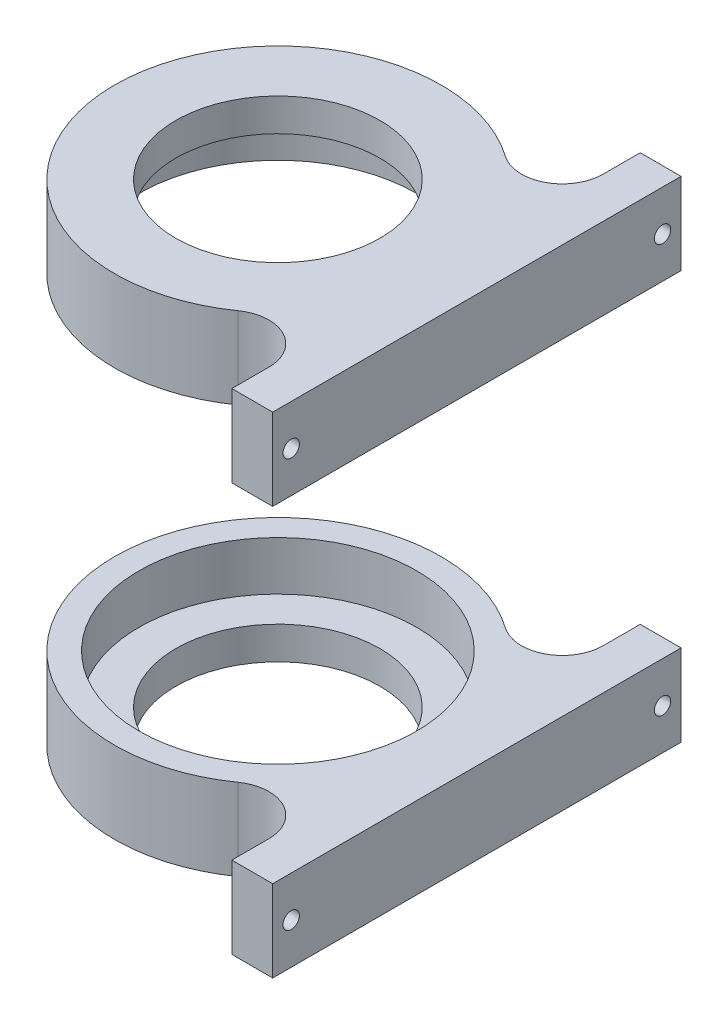
ISO-10303-21;
HEADER;
FILE_DESCRIPTION(('STEP AP214'),'2;1');
FILE_NAME('part.step','',(''),(''),'','','');
FILE_SCHEMA(('AUTOMOTIVE_DESIGN { 1 0 10303 214 1 1 1 1 }'));
ENDSEC;
DATA;
#1=APPLICATION_CONTEXT('core data for automotive mechanical design processes');
#2=APPLICATION_PROTOCOL_DEFINITION('international standard','automotive_design',2000,#1);
#3=PRODUCT_CONTEXT('',#1,'mechanical');
#4=PRODUCT('Part','Part','',(#3));
#5=PRODUCT_RELATED_PRODUCT_CATEGORY('part','',(#4));
#6=PRODUCT_DEFINITION_FORMATION('','',#4);
#7=PRODUCT_DEFINITION_CONTEXT('part definition',#1,'design');
#8=PRODUCT_DEFINITION('design','',#6,#7);
#9=PRODUCT_DEFINITION_SHAPE('','',#8);
#10=(LENGTH_UNIT() NAMED_UNIT(*) SI_UNIT(.MILLI.,.METRE.));
#11=(NAMED_UNIT(*) PLANE_ANGLE_UNIT() SI_UNIT($,.RADIAN.));
#12=(NAMED_UNIT(*) SI_UNIT($,.STERADIAN.) SOLID_ANGLE_UNIT());
#13=UNCERTAINTY_MEASURE_WITH_UNIT(LENGTH_MEASURE(1.E-05),#10,'distance_accuracy_value','');
#14=(GEOMETRIC_REPRESENTATION_CONTEXT(3) GLOBAL_UNCERTAINTY_ASSIGNED_CONTEXT((#13)) GLOBAL_UNIT_ASSIGNED_CONTEXT((#10,
#11,#12)) REPRESENTATION_CONTEXT('',''));
#15=CARTESIAN_POINT('',(0.,0.,0.));
#16=DIRECTION('',(0.,0.,1.));
#17=DIRECTION('',(1.,0.,0.));
#18=AXIS2_PLACEMENT_3D('',#15,#16,#17);
#19=CARTESIAN_POINT('',(-188.729833462074,-74.,50.));
#20=DIRECTION('',(0.,1.,0.));
#21=DIRECTION('',(0.,0.,1.));
#22=AXIS2_PLACEMENT_3D('',#19,#20,#21);
#23=CYLINDRICAL_SURFACE('',#22,34.);
#24=CARTESIAN_POINT('',(-188.729833462074,40.,50.));
#25=DIRECTION('',(0.,-1.,0.));
#26=DIRECTION('',(0.,0.,-1.));
#27=AXIS2_PLACEMENT_3D('',#24,#25,#26);
#28=CIRCLE('',#27,34.);
#29=CARTESIAN_POINT('',(-188.729833462074,40.,16.));
#30=VERTEX_POINT('',#29);
#31=EDGE_CURVE('E163',#30,#30,#28,.T.);
#32=ORIENTED_EDGE('',*,*,#31,.T.);
#33=EDGE_LOOP('',(#32));
#34=FACE_BOUND('',#33,.T.);
#35=CARTESIAN_POINT('',(-188.729833462074,52.,50.));
#36=DIRECTION('',(0.,1.,0.));
#37=DIRECTION('',(0.,0.,1.));
#38=AXIS2_PLACEMENT_3D('',#35,#36,#37);
#39=CIRCLE('',#38,34.);
#40=CARTESIAN_POINT('',(-188.729833462074,52.,84.));
#41=VERTEX_POINT('',#40);
#42=EDGE_CURVE('E12',#41,#41,#39,.F.);
#43=ORIENTED_EDGE('',*,*,#42,.F.);
#44=EDGE_LOOP('',(#43));
#45=FACE_BOUND('',#44,.T.);
#46=ADVANCED_FACE('F53',(#34,#45),#23,.F.);
#47=CARTESIAN_POINT('',(-160.,40.,90.9218360932337));
#48=DIRECTION('',(0.,1.,0.));
#49=DIRECTION('',(0.,0.,1.));
#50=AXIS2_PLACEMENT_3D('',#47,#48,#49);
#51=CYLINDRICAL_SURFACE('',#50,10.);
#52=DIRECTION('',(0.,1.,0.));
#53=VECTOR('',#52,1.);
#54=CARTESIAN_POINT('',(-165.745966692415,40.,82.737468874587));
#55=LINE('',#54,#53);
#56=CARTESIAN_POINT('',(-165.745966692415,40.,82.737468874587));
#57=VERTEX_POINT('',#56);
#58=CARTESIAN_POINT('',(-165.745966692415,60.,82.737468874587));
#59=VERTEX_POINT('',#58);
#60=EDGE_CURVE('E164',#57,#59,#55,.T.);
#61=ORIENTED_EDGE('',*,*,#60,.F.);
#62=CARTESIAN_POINT('',(-160.,40.,90.9218360932337));
#63=DIRECTION('',(0.,-1.,0.));
#64=DIRECTION('',(0.,0.,-1.));
#65=AXIS2_PLACEMENT_3D('',#62,#63,#64);
#66=CIRCLE('',#65,10.);
#67=CARTESIAN_POINT('',(-150.,40.,90.9218360932337));
#68=VERTEX_POINT('',#67);
#69=EDGE_CURVE('E151',#57,#68,#66,.T.);
#70=ORIENTED_EDGE('',*,*,#69,.T.);
#71=DIRECTION('',(0.,-1.,0.));
#72=VECTOR('',#71,1.);
#73=CARTESIAN_POINT('',(-150.,40.,90.9218360932337));
#74=LINE('',#73,#72);
#75=CARTESIAN_POINT('',(-150.,60.,90.9218360932337));
#76=VERTEX_POINT('',#75);
#77=EDGE_CURVE('E161',#76,#68,#74,.T.);
#78=ORIENTED_EDGE('',*,*,#77,.F.);
#79=CARTESIAN_POINT('',(-160.,60.,90.9218360932337));
#80=DIRECTION('',(0.,-1.,0.));
#81=DIRECTION('',(0.,0.,-1.));
#82=AXIS2_PLACEMENT_3D('',#79,#80,#81);
#83=CIRCLE('',#82,10.);
#84=EDGE_CURVE('E84',#76,#59,#83,.F.);
#85=ORIENTED_EDGE('',*,*,#84,.T.);
#86=EDGE_LOOP('',(#61,#70,#78,#85));
#87=FACE_BOUND('',#86,.T.);
#88=ADVANCED_FACE('F206',(#87),#51,.F.);
#89=CARTESIAN_POINT('',(-160.,40.,9.0781639067663));
#90=DIRECTION('',(0.,1.,0.));
#91=DIRECTION('',(0.,0.,1.));
#92=AXIS2_PLACEMENT_3D('',#89,#90,#91);
#93=CYLINDRICAL_SURFACE('',#92,10.);
#94=DIRECTION('',(0.,-1.,0.));
#95=VECTOR('',#94,1.);
#96=CARTESIAN_POINT('',(-150.,40.,9.0781639067663));
#97=LINE('',#96,#95);
#98=CARTESIAN_POINT('',(-150.,40.,9.0781639067663));
#99=VERTEX_POINT('',#98);
#100=CARTESIAN_POINT('',(-150.,60.,9.0781639067663));
#101=VERTEX_POINT('',#100);
#102=EDGE_CURVE('E61',#99,#101,#97,.F.);
#103=ORIENTED_EDGE('',*,*,#102,.F.);
#104=CARTESIAN_POINT('',(-160.,40.,9.0781639067663));
#105=DIRECTION('',(0.,-1.,0.));
#106=DIRECTION('',(0.,0.,-1.));
#107=AXIS2_PLACEMENT_3D('',#104,#105,#106);
#108=CIRCLE('',#107,10.);
#109=CARTESIAN_POINT('',(-165.745966692415,40.,17.262531125413));
#110=VERTEX_POINT('',#109);
#111=EDGE_CURVE('E159',#99,#110,#108,.T.);
#112=ORIENTED_EDGE('',*,*,#111,.T.);
#113=DIRECTION('',(0.,1.,0.));
#114=VECTOR('',#113,1.);
#115=CARTESIAN_POINT('',(-165.745966692415,40.,17.262531125413));
#116=LINE('',#115,#114);
#117=CARTESIAN_POINT('',(-165.745966692415,60.,17.262531125413));
#118=VERTEX_POINT('',#117);
#119=EDGE_CURVE('E172',#118,#110,#116,.F.);
#120=ORIENTED_EDGE('',*,*,#119,.F.);
#121=CARTESIAN_POINT('',(-160.,60.,9.0781639067663));
#122=DIRECTION('',(0.,-1.,0.));
#123=DIRECTION('',(0.,0.,-1.));
#124=AXIS2_PLACEMENT_3D('',#121,#122,#123);
#125=CIRCLE('',#124,10.);
#126=EDGE_CURVE('E167',#118,#101,#125,.F.);
#127=ORIENTED_EDGE('',*,*,#126,.T.);
#128=EDGE_LOOP('',(#103,#112,#120,#127));
#129=FACE_BOUND('',#128,.T.);
#130=ADVANCED_FACE('F192',(#129),#93,.F.);
#131=CARTESIAN_POINT('',(-150.,60.,100.));
#132=DIRECTION('',(0.,-1.,0.));
#133=DIRECTION('',(0.,0.,-1.));
#134=AXIS2_PLACEMENT_3D('',#131,#132,#133);
#135=PLANE('',#134);
#136=ORIENTED_EDGE('',*,*,#84,.F.);
#137=DIRECTION('',(0.,0.,1.));
#138=VECTOR('',#137,1.);
#139=CARTESIAN_POINT('',(-150.,60.,100.));
#140=LINE('',#139,#138);
#141=CARTESIAN_POINT('',(-150.,60.,100.));
#142=VERTEX_POINT('',#141);
#143=EDGE_CURVE('E92',#76,#142,#140,.T.);
#144=ORIENTED_EDGE('',*,*,#143,.T.);
#145=DIRECTION('',(-1.,0.,0.));
#146=VECTOR('',#145,1.);
#147=CARTESIAN_POINT('',(-140.,60.,100.));
#148=LINE('',#147,#146);
#149=CARTESIAN_POINT('',(-140.,60.,100.));
#150=VERTEX_POINT('',#149);
#151=EDGE_CURVE('E134',#150,#142,#148,.T.);
#152=ORIENTED_EDGE('',*,*,#151,.F.);
#153=DIRECTION('',(0.,0.,1.));
#154=VECTOR('',#153,1.);
#155=CARTESIAN_POINT('',(-140.,60.,100.));
#156=LINE('',#155,#154);
#157=CARTESIAN_POINT('',(-140.,60.,0.));
#158=VERTEX_POINT('',#157);
#159=EDGE_CURVE('E126',#158,#150,#156,.T.);
#160=ORIENTED_EDGE('',*,*,#159,.F.);
#161=DIRECTION('',(-1.,0.,0.));
#162=VECTOR('',#161,1.);
#163=CARTESIAN_POINT('',(-140.,60.,0.));
#164=LINE('',#163,#162);
#165=CARTESIAN_POINT('',(-150.,60.,0.));
#166=VERTEX_POINT('',#165);
#167=EDGE_CURVE('E131',#158,#166,#164,.T.);
#168=ORIENTED_EDGE('',*,*,#167,.T.);
#169=EDGE_CURVE('E195',#166,#101,#140,.T.);
#170=ORIENTED_EDGE('',*,*,#169,.T.);
#171=ORIENTED_EDGE('',*,*,#126,.F.);
#172=CARTESIAN_POINT('',(-188.729833462074,60.,50.));
#173=DIRECTION('',(0.,-1.,0.));
#174=DIRECTION('',(0.,0.,-1.));
#175=AXIS2_PLACEMENT_3D('',#172,#173,#174);
#176=CIRCLE('',#175,40.);
#177=EDGE_CURVE('E166',#59,#118,#176,.T.);
#178=ORIENTED_EDGE('',*,*,#177,.F.);
#179=EDGE_LOOP('',(#136,#144,#152,#160,#168,#170,#171,#178));
#180=FACE_BOUND('',#179,.T.);
#181=CARTESIAN_POINT('',(-188.729833462074,60.,50.));
#182=DIRECTION('',(0.,1.,0.));
#183=DIRECTION('',(0.,0.,1.));
#184=AXIS2_PLACEMENT_3D('',#181,#182,#183);
#185=CIRCLE('',#184,25.);
#186=CARTESIAN_POINT('',(-188.729833462074,60.,75.));
#187=VERTEX_POINT('',#186);
#188=EDGE_CURVE('E259',#187,#187,#185,.T.);
#189=ORIENTED_EDGE('',*,*,#188,.F.);
#190=EDGE_LOOP('',(#189));
#191=FACE_BOUND('',#190,.T.);
#192=ADVANCED_FACE('F128',(#180,#191),#135,.F.);
#193=CARTESIAN_POINT('',(-188.729833462074,40.,50.));
#194=DIRECTION('',(0.,1.,0.));
#195=DIRECTION('',(0.,0.,1.));
#196=AXIS2_PLACEMENT_3D('',#193,#194,#195);
#197=CYLINDRICAL_SURFACE('',#196,40.);
#198=CARTESIAN_POINT('',(-188.729833462074,40.,50.));
#199=DIRECTION('',(0.,-1.,0.));
#200=DIRECTION('',(0.,0.,-1.));
#201=AXIS2_PLACEMENT_3D('',#198,#199,#200);
#202=CIRCLE('',#201,40.);
#203=EDGE_CURVE('E175',#57,#110,#202,.T.);
#204=ORIENTED_EDGE('',*,*,#203,.F.);
#205=ORIENTED_EDGE('',*,*,#60,.T.);
#206=ORIENTED_EDGE('',*,*,#177,.T.);
#207=ORIENTED_EDGE('',*,*,#119,.T.);
#208=EDGE_LOOP('',(#204,#205,#206,#207));
#209=FACE_BOUND('',#208,.T.);
#210=ADVANCED_FACE('F186',(#209),#197,.T.);
#211=CARTESIAN_POINT('',(-188.729833462074,40.,50.));
#212=DIRECTION('',(0.,-1.,0.));
#213=DIRECTION('',(0.,0.,-1.));
#214=AXIS2_PLACEMENT_3D('',#211,#212,#213);
#215=PLANE('',#214);
#216=ORIENTED_EDGE('',*,*,#31,.F.);
#217=EDGE_LOOP('',(#216));
#218=FACE_BOUND('',#217,.T.);
#219=ORIENTED_EDGE('',*,*,#111,.F.);
#220=DIRECTION('',(0.,0.,-1.));
#221=VECTOR('',#220,1.);
#222=CARTESIAN_POINT('',(-150.,40.,100.));
#223=LINE('',#222,#221);
#224=CARTESIAN_POINT('',(-150.,40.,0.));
#225=VERTEX_POINT('',#224);
#226=EDGE_CURVE('E188',#99,#225,#223,.T.);
#227=ORIENTED_EDGE('',*,*,#226,.T.);
#228=DIRECTION('',(-1.,0.,0.));
#229=VECTOR('',#228,1.);
#230=CARTESIAN_POINT('',(-140.,40.,0.));
#231=LINE('',#230,#229);
#232=CARTESIAN_POINT('',(-140.,40.,0.));
#233=VERTEX_POINT('',#232);
#234=EDGE_CURVE('E203',#233,#225,#231,.T.);
#235=ORIENTED_EDGE('',*,*,#234,.F.);
#236=DIRECTION('',(0.,0.,-1.));
#237=VECTOR('',#236,1.);
#238=CARTESIAN_POINT('',(-140.,40.,100.));
#239=LINE('',#238,#237);
#240=CARTESIAN_POINT('',(-140.,40.,100.));
#241=VERTEX_POINT('',#240);
#242=EDGE_CURVE('E143',#241,#233,#239,.T.);
#243=ORIENTED_EDGE('',*,*,#242,.F.);
#244=DIRECTION('',(-1.,0.,0.));
#245=VECTOR('',#244,1.);
#246=CARTESIAN_POINT('',(-140.,40.,100.));
#247=LINE('',#246,#245);
#248=CARTESIAN_POINT('',(-150.,40.,100.));
#249=VERTEX_POINT('',#248);
#250=EDGE_CURVE('E155',#241,#249,#247,.T.);
#251=ORIENTED_EDGE('',*,*,#250,.T.);
#252=EDGE_CURVE('E69',#249,#68,#223,.T.);
#253=ORIENTED_EDGE('',*,*,#252,.T.);
#254=ORIENTED_EDGE('',*,*,#69,.F.);
#255=ORIENTED_EDGE('',*,*,#203,.T.);
#256=EDGE_LOOP('',(#219,#227,#235,#243,#251,#253,#254,#255));
#257=FACE_BOUND('',#256,.T.);
#258=ADVANCED_FACE('F183',(#218,#257),#215,.T.);
#259=CARTESIAN_POINT('',(-150.,0.,0.));
#260=DIRECTION('',(1.,0.,0.));
#261=DIRECTION('',(0.,0.,-1.));
#262=AXIS2_PLACEMENT_3D('',#259,#260,#261);
#263=PLANE('',#262);
#264=CARTESIAN_POINT('',(-150.,50.,95.4609180466169));
#265=DIRECTION('',(-1.,0.,0.));
#266=DIRECTION('',(0.,0.,1.));
#267=AXIS2_PLACEMENT_3D('',#264,#265,#266);
#268=CIRCLE('',#267,2.);
#269=CARTESIAN_POINT('',(-150.,50.,97.4609180466169));
#270=VERTEX_POINT('',#269);
#271=EDGE_CURVE('E267',#270,#270,#268,.T.);
#272=ORIENTED_EDGE('',*,*,#271,.F.);
#273=EDGE_LOOP('',(#272));
#274=FACE_BOUND('',#273,.T.);
#275=ORIENTED_EDGE('',*,*,#143,.F.);
#276=ORIENTED_EDGE('',*,*,#77,.T.);
#277=ORIENTED_EDGE('',*,*,#252,.F.);
#278=DIRECTION('',(0.,-1.,0.));
#279=VECTOR('',#278,1.);
#280=CARTESIAN_POINT('',(-150.,60.,100.));
#281=LINE('',#280,#279);
#282=EDGE_CURVE('E196',#142,#249,#281,.T.);
#283=ORIENTED_EDGE('',*,*,#282,.F.);
#284=EDGE_LOOP('',(#275,#276,#277,#283));
#285=FACE_BOUND('',#284,.T.);
#286=ADVANCED_FACE('F185',(#274,#285),#263,.F.);
#287=CARTESIAN_POINT('',(-140.,60.,0.));
#288=DIRECTION('',(0.,0.,1.));
#289=DIRECTION('',(1.,0.,0.));
#290=AXIS2_PLACEMENT_3D('',#287,#288,#289);
#291=PLANE('',#290);
#292=DIRECTION('',(0.,1.,0.));
#293=VECTOR('',#292,1.);
#294=CARTESIAN_POINT('',(-150.,60.,0.));
#295=LINE('',#294,#293);
#296=EDGE_CURVE('E150',#225,#166,#295,.T.);
#297=ORIENTED_EDGE('',*,*,#296,.T.);
#298=ORIENTED_EDGE('',*,*,#167,.F.);
#299=DIRECTION('',(0.,1.,0.));
#300=VECTOR('',#299,1.);
#301=CARTESIAN_POINT('',(-140.,60.,0.));
#302=LINE('',#301,#300);
#303=EDGE_CURVE('E138',#233,#158,#302,.T.);
#304=ORIENTED_EDGE('',*,*,#303,.F.);
#305=ORIENTED_EDGE('',*,*,#234,.T.);
#306=EDGE_LOOP('',(#297,#298,#304,#305));
#307=FACE_BOUND('',#306,.T.);
#308=ADVANCED_FACE('F148',(#307),#291,.F.);
#309=CARTESIAN_POINT('',(-140.,60.,100.));
#310=DIRECTION('',(0.,0.,-1.));
#311=DIRECTION('',(-1.,0.,0.));
#312=AXIS2_PLACEMENT_3D('',#309,#310,#311);
#313=PLANE('',#312);
#314=ORIENTED_EDGE('',*,*,#282,.T.);
#315=ORIENTED_EDGE('',*,*,#250,.F.);
#316=DIRECTION('',(0.,-1.,0.));
#317=VECTOR('',#316,1.);
#318=CARTESIAN_POINT('',(-140.,60.,100.));
#319=LINE('',#318,#317);
#320=EDGE_CURVE('E137',#150,#241,#319,.T.);
#321=ORIENTED_EDGE('',*,*,#320,.F.);
#322=ORIENTED_EDGE('',*,*,#151,.T.);
#323=EDGE_LOOP('',(#314,#315,#321,#322));
#324=FACE_BOUND('',#323,.T.);
#325=ADVANCED_FACE('F226',(#324),#313,.F.);
#326=CARTESIAN_POINT('',(-140.,0.,0.));
#327=DIRECTION('',(1.,0.,0.));
#328=DIRECTION('',(0.,0.,-1.));
#329=AXIS2_PLACEMENT_3D('',#326,#327,#328);
#330=PLANE('',#329);
#331=CARTESIAN_POINT('',(-140.,50.,4.53908195338315));
#332=DIRECTION('',(1.,0.,0.));
#333=DIRECTION('',(0.,0.,-1.));
#334=AXIS2_PLACEMENT_3D('',#331,#332,#333);
#335=CIRCLE('',#334,2.);
#336=CARTESIAN_POINT('',(-140.,50.,2.53908195338315));
#337=VERTEX_POINT('',#336);
#338=EDGE_CURVE('E264',#337,#337,#335,.T.);
#339=ORIENTED_EDGE('',*,*,#338,.F.);
#340=EDGE_LOOP('',(#339));
#341=FACE_BOUND('',#340,.T.);
#342=CARTESIAN_POINT('',(-140.,50.,95.4609180466169));
#343=DIRECTION('',(-1.,0.,0.));
#344=DIRECTION('',(0.,0.,1.));
#345=AXIS2_PLACEMENT_3D('',#342,#343,#344);
#346=CIRCLE('',#345,2.);
#347=CARTESIAN_POINT('',(-140.,50.,97.4609180466169));
#348=VERTEX_POINT('',#347);
#349=EDGE_CURVE('E270',#348,#348,#346,.T.);
#350=ORIENTED_EDGE('',*,*,#349,.T.);
#351=EDGE_LOOP('',(#350));
#352=FACE_BOUND('',#351,.T.);
#353=ORIENTED_EDGE('',*,*,#303,.T.);
#354=ORIENTED_EDGE('',*,*,#159,.T.);
#355=ORIENTED_EDGE('',*,*,#320,.T.);
#356=ORIENTED_EDGE('',*,*,#242,.T.);
#357=EDGE_LOOP('',(#353,#354,#355,#356));
#358=FACE_BOUND('',#357,.T.);
#359=ADVANCED_FACE('F141',(#341,#352,#358),#330,.T.);
#360=CARTESIAN_POINT('',(-150.,50.,4.53908195338315));
#361=DIRECTION('',(1.,0.,0.));
#362=DIRECTION('',(0.,0.,-1.));
#363=AXIS2_PLACEMENT_3D('',#360,#361,#362);
#364=CIRCLE('',#363,2.);
#365=CARTESIAN_POINT('',(-150.,50.,2.53908195338315));
#366=VERTEX_POINT('',#365);
#367=EDGE_CURVE('E261',#366,#366,#364,.T.);
#368=ORIENTED_EDGE('',*,*,#367,.T.);
#369=EDGE_LOOP('',(#368));
#370=FACE_BOUND('',#369,.T.);
#371=ORIENTED_EDGE('',*,*,#102,.T.);
#372=ORIENTED_EDGE('',*,*,#169,.F.);
#373=ORIENTED_EDGE('',*,*,#296,.F.);
#374=ORIENTED_EDGE('',*,*,#226,.F.);
#375=EDGE_LOOP('',(#371,#372,#373,#374));
#376=FACE_BOUND('',#375,.T.);
#377=ADVANCED_FACE('F229',(#370,#376),#263,.F.);
#378=CARTESIAN_POINT('',(-140.,50.,95.4609180466169));
#379=DIRECTION('',(-1.,0.,0.));
#380=DIRECTION('',(0.,0.,1.));
#381=AXIS2_PLACEMENT_3D('',#378,#379,#380);
#382=CYLINDRICAL_SURFACE('',#381,2.);
#383=ORIENTED_EDGE('',*,*,#349,.F.);
#384=EDGE_LOOP('',(#383));
#385=FACE_BOUND('',#384,.T.);
#386=ORIENTED_EDGE('',*,*,#271,.T.);
#387=EDGE_LOOP('',(#386));
#388=FACE_BOUND('',#387,.T.);
#389=ADVANCED_FACE('F232',(#385,#388),#382,.F.);
#390=CARTESIAN_POINT('',(-140.,50.,4.53908195338315));
#391=DIRECTION('',(-1.,0.,0.));
#392=DIRECTION('',(0.,0.,1.));
#393=AXIS2_PLACEMENT_3D('',#390,#391,#392);
#394=CYLINDRICAL_SURFACE('',#393,2.);
#395=ORIENTED_EDGE('',*,*,#338,.T.);
#396=EDGE_LOOP('',(#395));
#397=FACE_BOUND('',#396,.T.);
#398=ORIENTED_EDGE('',*,*,#367,.F.);
#399=EDGE_LOOP('',(#398));
#400=FACE_BOUND('',#399,.T.);
#401=ADVANCED_FACE('F239',(#397,#400),#394,.F.);
#402=CARTESIAN_POINT('',(-188.729833462074,52.,50.));
#403=DIRECTION('',(0.,1.,0.));
#404=DIRECTION('',(0.,0.,1.));
#405=AXIS2_PLACEMENT_3D('',#402,#403,#404);
#406=PLANE('',#405);
#407=CARTESIAN_POINT('',(-188.729833462074,52.,50.));
#408=DIRECTION('',(0.,1.,0.));
#409=DIRECTION('',(0.,0.,1.));
#410=AXIS2_PLACEMENT_3D('',#407,#408,#409);
#411=CIRCLE('',#410,25.);
#412=CARTESIAN_POINT('',(-188.729833462074,52.,75.));
#413=VERTEX_POINT('',#412);
#414=EDGE_CURVE('E256',#413,#413,#411,.T.);
#415=ORIENTED_EDGE('',*,*,#414,.T.);
#416=EDGE_LOOP('',(#415));
#417=FACE_BOUND('',#416,.T.);
#418=ORIENTED_EDGE('',*,*,#42,.T.);
#419=EDGE_LOOP('',(#418));
#420=FACE_BOUND('',#419,.T.);
#421=ADVANCED_FACE('F243',(#417,#420),#406,.F.);
#422=CARTESIAN_POINT('',(-188.729833462074,52.,50.));
#423=DIRECTION('',(0.,1.,0.));
#424=DIRECTION('',(0.,0.,1.));
#425=AXIS2_PLACEMENT_3D('',#422,#423,#424);
#426=CYLINDRICAL_SURFACE('',#425,25.);
#427=ORIENTED_EDGE('',*,*,#414,.F.);
#428=EDGE_LOOP('',(#427));
#429=FACE_BOUND('',#428,.T.);
#430=ORIENTED_EDGE('',*,*,#188,.T.);
#431=EDGE_LOOP('',(#430));
#432=FACE_BOUND('',#431,.T.);
#433=ADVANCED_FACE('F247',(#429,#432),#426,.F.);
#434=CLOSED_SHELL('',(#46,#88,#130,#192,#210,#258,#286,#308,#325,#359,#377,#389,#401,#421,#433));
#435=MANIFOLD_SOLID_BREP('B2',#434);
#436=CARTESIAN_POINT('',(-188.729833462074,-74.,50.));
#437=DIRECTION('',(0.,1.,0.));
#438=DIRECTION('',(0.,0.,1.));
#439=AXIS2_PLACEMENT_3D('',#436,#437,#438);
#440=CYLINDRICAL_SURFACE('',#439,34.);
#441=CARTESIAN_POINT('',(-188.729833462074,-40.,50.));
#442=DIRECTION('',(0.,1.,0.));
#443=DIRECTION('',(0.,0.,1.));
#444=AXIS2_PLACEMENT_3D('',#441,#442,#443);
#445=CIRCLE('',#444,34.);
#446=CARTESIAN_POINT('',(-188.729833462074,-40.,84.));
#447=VERTEX_POINT('',#446);
#448=EDGE_CURVE('E512',#447,#447,#445,.T.);
#449=ORIENTED_EDGE('',*,*,#448,.T.);
#450=EDGE_LOOP('',(#449));
#451=FACE_BOUND('',#450,.T.);
#452=CARTESIAN_POINT('',(-188.729833462074,-52.,50.));
#453=DIRECTION('',(0.,-1.,0.));
#454=DIRECTION('',(0.,0.,-1.));
#455=AXIS2_PLACEMENT_3D('',#452,#453,#454);
#456=CIRCLE('',#455,34.);
#457=CARTESIAN_POINT('',(-188.729833462074,-52.,16.));
#458=VERTEX_POINT('',#457);
#459=EDGE_CURVE('E51',#458,#458,#456,.F.);
#460=ORIENTED_EDGE('',*,*,#459,.F.);
#461=EDGE_LOOP('',(#460));
#462=FACE_BOUND('',#461,.T.);
#463=ADVANCED_FACE('F416',(#451,#462),#440,.F.);
#464=CARTESIAN_POINT('',(-188.729833462074,-40.,50.));
#465=DIRECTION('',(0.,-1.,0.));
#466=DIRECTION('',(0.,0.,-1.));
#467=AXIS2_PLACEMENT_3D('',#464,#465,#466);
#468=CYLINDRICAL_SURFACE('',#467,40.);
#469=CARTESIAN_POINT('',(-188.729833462074,-40.,50.));
#470=DIRECTION('',(0.,-1.,0.));
#471=DIRECTION('',(0.,0.,-1.));
#472=AXIS2_PLACEMENT_3D('',#469,#470,#471);
#473=CIRCLE('',#472,40.);
#474=CARTESIAN_POINT('',(-165.745966692415,-40.,82.7374688745869));
#475=VERTEX_POINT('',#474);
#476=CARTESIAN_POINT('',(-165.745966692415,-40.,17.2625311254131));
#477=VERTEX_POINT('',#476);
#478=EDGE_CURVE('E522',#475,#477,#473,.T.);
#479=ORIENTED_EDGE('',*,*,#478,.T.);
#480=DIRECTION('',(0.,-1.,0.));
#481=VECTOR('',#480,1.);
#482=CARTESIAN_POINT('',(-165.745966692415,-40.,17.2625311254131));
#483=LINE('',#482,#481);
#484=CARTESIAN_POINT('',(-165.745966692415,-60.,17.2625311254131));
#485=VERTEX_POINT('',#484);
#486=EDGE_CURVE('E547',#477,#485,#483,.T.);
#487=ORIENTED_EDGE('',*,*,#486,.T.);
#488=CARTESIAN_POINT('',(-188.729833462074,-60.,50.));
#489=DIRECTION('',(0.,-1.,0.));
#490=DIRECTION('',(0.,0.,-1.));
#491=AXIS2_PLACEMENT_3D('',#488,#489,#490);
#492=CIRCLE('',#491,40.);
#493=CARTESIAN_POINT('',(-165.745966692415,-60.,82.7374688745869));
#494=VERTEX_POINT('',#493);
#495=EDGE_CURVE('E517',#494,#485,#492,.T.);
#496=ORIENTED_EDGE('',*,*,#495,.F.);
#497=DIRECTION('',(0.,-1.,0.));
#498=VECTOR('',#497,1.);
#499=CARTESIAN_POINT('',(-165.745966692415,-40.,82.7374688745869));
#500=LINE('',#499,#498);
#501=EDGE_CURVE('E533',#494,#475,#500,.F.);
#502=ORIENTED_EDGE('',*,*,#501,.T.);
#503=EDGE_LOOP('',(#479,#487,#496,#502));
#504=FACE_BOUND('',#503,.T.);
#505=ADVANCED_FACE('F555',(#504),#468,.T.);
#506=CARTESIAN_POINT('',(-150.,-60.,100.));
#507=DIRECTION('',(0.,1.,0.));
#508=DIRECTION('',(0.,0.,1.));
#509=AXIS2_PLACEMENT_3D('',#506,#507,#508);
#510=PLANE('',#509);
#511=CARTESIAN_POINT('',(-160.,-60.,9.07816390676632));
#512=DIRECTION('',(0.,1.,0.));
#513=DIRECTION('',(0.,0.,1.));
#514=AXIS2_PLACEMENT_3D('',#511,#512,#513);
#515=CIRCLE('',#514,10.);
#516=CARTESIAN_POINT('',(-150.,-60.,9.07816390676632));
#517=VERTEX_POINT('',#516);
#518=EDGE_CURVE('E438',#517,#485,#515,.F.);
#519=ORIENTED_EDGE('',*,*,#518,.F.);
#520=DIRECTION('',(0.,0.,-1.));
#521=VECTOR('',#520,1.);
#522=CARTESIAN_POINT('',(-150.,-60.,100.));
#523=LINE('',#522,#521);
#524=CARTESIAN_POINT('',(-150.,-60.,0.));
#525=VERTEX_POINT('',#524);
#526=EDGE_CURVE('E577',#517,#525,#523,.T.);
#527=ORIENTED_EDGE('',*,*,#526,.T.);
#528=DIRECTION('',(-1.,0.,0.));
#529=VECTOR('',#528,1.);
#530=CARTESIAN_POINT('',(-140.,-60.,0.));
#531=LINE('',#530,#529);
#532=CARTESIAN_POINT('',(-140.,-60.,0.));
#533=VERTEX_POINT('',#532);
#534=EDGE_CURVE('E580',#533,#525,#531,.T.);
#535=ORIENTED_EDGE('',*,*,#534,.F.);
#536=DIRECTION('',(0.,0.,-1.));
#537=VECTOR('',#536,1.);
#538=CARTESIAN_POINT('',(-140.,-60.,100.));
#539=LINE('',#538,#537);
#540=CARTESIAN_POINT('',(-140.,-60.,100.));
#541=VERTEX_POINT('',#540);
#542=EDGE_CURVE('E501',#541,#533,#539,.T.);
#543=ORIENTED_EDGE('',*,*,#542,.F.);
#544=DIRECTION('',(-1.,0.,0.));
#545=VECTOR('',#544,1.);
#546=CARTESIAN_POINT('',(-140.,-60.,100.));
#547=LINE('',#546,#545);
#548=CARTESIAN_POINT('',(-150.,-60.,100.));
#549=VERTEX_POINT('',#548);
#550=EDGE_CURVE('E518',#541,#549,#547,.T.);
#551=ORIENTED_EDGE('',*,*,#550,.T.);
#552=CARTESIAN_POINT('',(-150.,-60.,90.9218360932337));
#553=VERTEX_POINT('',#552);
#554=EDGE_CURVE('E506',#549,#553,#523,.T.);
#555=ORIENTED_EDGE('',*,*,#554,.T.);
#556=CARTESIAN_POINT('',(-160.,-60.,90.9218360932337));
#557=DIRECTION('',(0.,1.,0.));
#558=DIRECTION('',(0.,0.,1.));
#559=AXIS2_PLACEMENT_3D('',#556,#557,#558);
#560=CIRCLE('',#559,10.);
#561=EDGE_CURVE('E540',#494,#553,#560,.F.);
#562=ORIENTED_EDGE('',*,*,#561,.F.);
#563=ORIENTED_EDGE('',*,*,#495,.T.);
#564=EDGE_LOOP('',(#519,#527,#535,#543,#551,#555,#562,#563));
#565=FACE_BOUND('',#564,.T.);
#566=CARTESIAN_POINT('',(-188.729833462074,-60.,50.));
#567=DIRECTION('',(0.,-1.,0.));
#568=DIRECTION('',(0.,0.,-1.));
#569=AXIS2_PLACEMENT_3D('',#566,#567,#568);
#570=CIRCLE('',#569,25.);
#571=CARTESIAN_POINT('',(-188.729833462074,-60.,25.));
#572=VERTEX_POINT('',#571);
#573=EDGE_CURVE('E610',#572,#572,#570,.T.);
#574=ORIENTED_EDGE('',*,*,#573,.F.);
#575=EDGE_LOOP('',(#574));
#576=FACE_BOUND('',#575,.T.);
#577=ADVANCED_FACE('F586',(#565,#576),#510,.F.);
#578=CARTESIAN_POINT('',(-188.729833462074,-40.,50.));
#579=DIRECTION('',(0.,1.,0.));
#580=DIRECTION('',(0.,0.,-1.));
#581=AXIS2_PLACEMENT_3D('',#578,#579,#580);
#582=PLANE('',#581);
#583=ORIENTED_EDGE('',*,*,#448,.F.);
#584=EDGE_LOOP('',(#583));
#585=FACE_BOUND('',#584,.T.);
#586=CARTESIAN_POINT('',(-160.,-40.,90.9218360932337));
#587=DIRECTION('',(0.,1.,0.));
#588=DIRECTION('',(0.,0.,1.));
#589=AXIS2_PLACEMENT_3D('',#586,#587,#588);
#590=CIRCLE('',#589,10.);
#591=CARTESIAN_POINT('',(-150.,-40.,90.9218360932337));
#592=VERTEX_POINT('',#591);
#593=EDGE_CURVE('E537',#592,#475,#590,.T.);
#594=ORIENTED_EDGE('',*,*,#593,.F.);
#595=DIRECTION('',(0.,0.,1.));
#596=VECTOR('',#595,1.);
#597=CARTESIAN_POINT('',(-150.,-40.,100.));
#598=LINE('',#597,#596);
#599=CARTESIAN_POINT('',(-150.,-40.,100.));
#600=VERTEX_POINT('',#599);
#601=EDGE_CURVE('E558',#592,#600,#598,.T.);
#602=ORIENTED_EDGE('',*,*,#601,.T.);
#603=DIRECTION('',(-1.,0.,0.));
#604=VECTOR('',#603,1.);
#605=CARTESIAN_POINT('',(-140.,-40.,100.));
#606=LINE('',#605,#604);
#607=CARTESIAN_POINT('',(-140.,-40.,100.));
#608=VERTEX_POINT('',#607);
#609=EDGE_CURVE('E491',#608,#600,#606,.T.);
#610=ORIENTED_EDGE('',*,*,#609,.F.);
#611=DIRECTION('',(0.,0.,1.));
#612=VECTOR('',#611,1.);
#613=CARTESIAN_POINT('',(-140.,-40.,100.));
#614=LINE('',#613,#612);
#615=CARTESIAN_POINT('',(-140.,-40.,0.));
#616=VERTEX_POINT('',#615);
#617=EDGE_CURVE('E483',#616,#608,#614,.T.);
#618=ORIENTED_EDGE('',*,*,#617,.F.);
#619=DIRECTION('',(-1.,0.,0.));
#620=VECTOR('',#619,1.);
#621=CARTESIAN_POINT('',(-140.,-40.,0.));
#622=LINE('',#621,#620);
#623=CARTESIAN_POINT('',(-150.,-40.,0.));
#624=VERTEX_POINT('',#623);
#625=EDGE_CURVE('E488',#616,#624,#622,.T.);
#626=ORIENTED_EDGE('',*,*,#625,.T.);
#627=CARTESIAN_POINT('',(-150.,-40.,9.07816390676632));
#628=VERTEX_POINT('',#627);
#629=EDGE_CURVE('E567',#624,#628,#598,.T.);
#630=ORIENTED_EDGE('',*,*,#629,.T.);
#631=CARTESIAN_POINT('',(-160.,-40.,9.07816390676632));
#632=DIRECTION('',(0.,1.,0.));
#633=DIRECTION('',(0.,0.,1.));
#634=AXIS2_PLACEMENT_3D('',#631,#632,#633);
#635=CIRCLE('',#634,10.);
#636=EDGE_CURVE('E425',#477,#628,#635,.T.);
#637=ORIENTED_EDGE('',*,*,#636,.F.);
#638=ORIENTED_EDGE('',*,*,#478,.F.);
#639=EDGE_LOOP('',(#594,#602,#610,#618,#626,#630,#637,#638));
#640=FACE_BOUND('',#639,.T.);
#641=ADVANCED_FACE('F486',(#585,#640),#582,.T.);
#642=CARTESIAN_POINT('',(-160.,-40.,90.9218360932337));
#643=DIRECTION('',(0.,-1.,0.));
#644=DIRECTION('',(0.,0.,-1.));
#645=AXIS2_PLACEMENT_3D('',#642,#643,#644);
#646=CYLINDRICAL_SURFACE('',#645,10.);
#647=DIRECTION('',(0.,-1.,0.));
#648=VECTOR('',#647,1.);
#649=CARTESIAN_POINT('',(-150.,60.,90.9218360932337));
#650=LINE('',#649,#648);
#651=EDGE_CURVE('E526',#592,#553,#650,.T.);
#652=ORIENTED_EDGE('',*,*,#651,.F.);
#653=ORIENTED_EDGE('',*,*,#593,.T.);
#654=ORIENTED_EDGE('',*,*,#501,.F.);
#655=ORIENTED_EDGE('',*,*,#561,.T.);
#656=EDGE_LOOP('',(#652,#653,#654,#655));
#657=FACE_BOUND('',#656,.T.);
#658=ADVANCED_FACE('F560',(#657),#646,.F.);
#659=CARTESIAN_POINT('',(-160.,-40.,9.07816390676632));
#660=DIRECTION('',(0.,-1.,0.));
#661=DIRECTION('',(0.,0.,-1.));
#662=AXIS2_PLACEMENT_3D('',#659,#660,#661);
#663=CYLINDRICAL_SURFACE('',#662,10.);
#664=DIRECTION('',(0.,-1.,0.));
#665=VECTOR('',#664,1.);
#666=CARTESIAN_POINT('',(-150.,60.,9.07816390676633));
#667=LINE('',#666,#665);
#668=EDGE_CURVE('E544',#517,#628,#667,.F.);
#669=ORIENTED_EDGE('',*,*,#668,.F.);
#670=ORIENTED_EDGE('',*,*,#518,.T.);
#671=ORIENTED_EDGE('',*,*,#486,.F.);
#672=ORIENTED_EDGE('',*,*,#636,.T.);
#673=EDGE_LOOP('',(#669,#670,#671,#672));
#674=FACE_BOUND('',#673,.T.);
#675=ADVANCED_FACE('F418',(#674),#663,.F.);
#676=CARTESIAN_POINT('',(-150.,0.,0.));
#677=DIRECTION('',(1.,0.,0.));
#678=DIRECTION('',(0.,0.,-1.));
#679=AXIS2_PLACEMENT_3D('',#676,#677,#678);
#680=PLANE('',#679);
#681=CARTESIAN_POINT('',(-150.,-50.,4.53908195338315));
#682=DIRECTION('',(1.,0.,0.));
#683=DIRECTION('',(0.,0.,-1.));
#684=AXIS2_PLACEMENT_3D('',#681,#682,#683);
#685=CIRCLE('',#684,2.);
#686=CARTESIAN_POINT('',(-150.,-50.,2.53908195338315));
#687=VERTEX_POINT('',#686);
#688=EDGE_CURVE('E602',#687,#687,#685,.T.);
#689=ORIENTED_EDGE('',*,*,#688,.T.);
#690=EDGE_LOOP('',(#689));
#691=FACE_BOUND('',#690,.T.);
#692=ORIENTED_EDGE('',*,*,#526,.F.);
#693=ORIENTED_EDGE('',*,*,#668,.T.);
#694=ORIENTED_EDGE('',*,*,#629,.F.);
#695=DIRECTION('',(0.,1.,0.));
#696=VECTOR('',#695,1.);
#697=CARTESIAN_POINT('',(-150.,-40.,0.));
#698=LINE('',#697,#696);
#699=EDGE_CURVE('E510',#525,#624,#698,.T.);
#700=ORIENTED_EDGE('',*,*,#699,.F.);
#701=EDGE_LOOP('',(#692,#693,#694,#700));
#702=FACE_BOUND('',#701,.T.);
#703=ADVANCED_FACE('F644',(#691,#702),#680,.F.);
#704=CARTESIAN_POINT('',(-140.,-40.,0.));
#705=DIRECTION('',(0.,0.,1.));
#706=DIRECTION('',(1.,0.,0.));
#707=AXIS2_PLACEMENT_3D('',#704,#705,#706);
#708=PLANE('',#707);
#709=ORIENTED_EDGE('',*,*,#699,.T.);
#710=ORIENTED_EDGE('',*,*,#625,.F.);
#711=DIRECTION('',(0.,1.,0.));
#712=VECTOR('',#711,1.);
#713=CARTESIAN_POINT('',(-140.,-40.,0.));
#714=LINE('',#713,#712);
#715=EDGE_CURVE('E496',#533,#616,#714,.T.);
#716=ORIENTED_EDGE('',*,*,#715,.F.);
#717=ORIENTED_EDGE('',*,*,#534,.T.);
#718=EDGE_LOOP('',(#709,#710,#716,#717));
#719=FACE_BOUND('',#718,.T.);
#720=ADVANCED_FACE('F508',(#719),#708,.F.);
#721=CARTESIAN_POINT('',(-140.,-40.,100.));
#722=DIRECTION('',(0.,0.,-1.));
#723=DIRECTION('',(-1.,0.,0.));
#724=AXIS2_PLACEMENT_3D('',#721,#722,#723);
#725=PLANE('',#724);
#726=DIRECTION('',(0.,-1.,0.));
#727=VECTOR('',#726,1.);
#728=CARTESIAN_POINT('',(-150.,-40.,100.));
#729=LINE('',#728,#727);
#730=EDGE_CURVE('E565',#600,#549,#729,.T.);
#731=ORIENTED_EDGE('',*,*,#730,.T.);
#732=ORIENTED_EDGE('',*,*,#550,.F.);
#733=DIRECTION('',(0.,-1.,0.));
#734=VECTOR('',#733,1.);
#735=CARTESIAN_POINT('',(-140.,-40.,100.));
#736=LINE('',#735,#734);
#737=EDGE_CURVE('E495',#608,#541,#736,.T.);
#738=ORIENTED_EDGE('',*,*,#737,.F.);
#739=ORIENTED_EDGE('',*,*,#609,.T.);
#740=EDGE_LOOP('',(#731,#732,#738,#739));
#741=FACE_BOUND('',#740,.T.);
#742=ADVANCED_FACE('F589',(#741),#725,.F.);
#743=CARTESIAN_POINT('',(-140.,0.,0.));
#744=DIRECTION('',(1.,0.,0.));
#745=DIRECTION('',(0.,0.,-1.));
#746=AXIS2_PLACEMENT_3D('',#743,#744,#745);
#747=PLANE('',#746);
#748=CARTESIAN_POINT('',(-140.,-50.,4.53908195338315));
#749=DIRECTION('',(1.,0.,0.));
#750=DIRECTION('',(0.,0.,-1.));
#751=AXIS2_PLACEMENT_3D('',#748,#749,#750);
#752=CIRCLE('',#751,2.);
#753=CARTESIAN_POINT('',(-140.,-50.,2.53908195338315));
#754=VERTEX_POINT('',#753);
#755=EDGE_CURVE('E598',#754,#754,#752,.T.);
#756=ORIENTED_EDGE('',*,*,#755,.F.);
#757=EDGE_LOOP('',(#756));
#758=FACE_BOUND('',#757,.T.);
#759=CARTESIAN_POINT('',(-140.,-50.,95.4609180466169));
#760=DIRECTION('',(-1.,0.,0.));
#761=DIRECTION('',(0.,0.,1.));
#762=AXIS2_PLACEMENT_3D('',#759,#760,#761);
#763=CIRCLE('',#762,2.);
#764=CARTESIAN_POINT('',(-140.,-50.,97.4609180466169));
#765=VERTEX_POINT('',#764);
#766=EDGE_CURVE('E571',#765,#765,#763,.T.);
#767=ORIENTED_EDGE('',*,*,#766,.T.);
#768=EDGE_LOOP('',(#767));
#769=FACE_BOUND('',#768,.T.);
#770=ORIENTED_EDGE('',*,*,#715,.T.);
#771=ORIENTED_EDGE('',*,*,#617,.T.);
#772=ORIENTED_EDGE('',*,*,#737,.T.);
#773=ORIENTED_EDGE('',*,*,#542,.T.);
#774=EDGE_LOOP('',(#770,#771,#772,#773));
#775=FACE_BOUND('',#774,.T.);
#776=ADVANCED_FACE('F499',(#758,#769,#775),#747,.T.);
#777=CARTESIAN_POINT('',(-150.,-50.,95.4609180466169));
#778=DIRECTION('',(-1.,0.,0.));
#779=DIRECTION('',(0.,0.,1.));
#780=AXIS2_PLACEMENT_3D('',#777,#778,#779);
#781=CIRCLE('',#780,2.);
#782=CARTESIAN_POINT('',(-150.,-50.,97.4609180466169));
#783=VERTEX_POINT('',#782);
#784=EDGE_CURVE('E594',#783,#783,#781,.T.);
#785=ORIENTED_EDGE('',*,*,#784,.F.);
#786=EDGE_LOOP('',(#785));
#787=FACE_BOUND('',#786,.T.);
#788=ORIENTED_EDGE('',*,*,#651,.T.);
#789=ORIENTED_EDGE('',*,*,#554,.F.);
#790=ORIENTED_EDGE('',*,*,#730,.F.);
#791=ORIENTED_EDGE('',*,*,#601,.F.);
#792=EDGE_LOOP('',(#788,#789,#790,#791));
#793=FACE_BOUND('',#792,.T.);
#794=ADVANCED_FACE('F563',(#787,#793),#680,.F.);
#795=CARTESIAN_POINT('',(-140.,-50.,95.4609180466169));
#796=DIRECTION('',(-1.,0.,0.));
#797=DIRECTION('',(0.,0.,1.));
#798=AXIS2_PLACEMENT_3D('',#795,#796,#797);
#799=CYLINDRICAL_SURFACE('',#798,2.);
#800=ORIENTED_EDGE('',*,*,#766,.F.);
#801=EDGE_LOOP('',(#800));
#802=FACE_BOUND('',#801,.T.);
#803=ORIENTED_EDGE('',*,*,#784,.T.);
#804=EDGE_LOOP('',(#803));
#805=FACE_BOUND('',#804,.T.);
#806=ADVANCED_FACE('F649',(#802,#805),#799,.F.);
#807=CARTESIAN_POINT('',(-140.,-50.,4.53908195338315));
#808=DIRECTION('',(-1.,0.,0.));
#809=DIRECTION('',(0.,0.,1.));
#810=AXIS2_PLACEMENT_3D('',#807,#808,#809);
#811=CYLINDRICAL_SURFACE('',#810,2.);
#812=ORIENTED_EDGE('',*,*,#755,.T.);
#813=EDGE_LOOP('',(#812));
#814=FACE_BOUND('',#813,.T.);
#815=ORIENTED_EDGE('',*,*,#688,.F.);
#816=EDGE_LOOP('',(#815));
#817=FACE_BOUND('',#816,.T.);
#818=ADVANCED_FACE('F656',(#814,#817),#811,.F.);
#819=CARTESIAN_POINT('',(-188.729833462074,-52.,50.));
#820=DIRECTION('',(0.,-1.,0.));
#821=DIRECTION('',(0.,0.,-1.));
#822=AXIS2_PLACEMENT_3D('',#819,#820,#821);
#823=PLANE('',#822);
#824=CARTESIAN_POINT('',(-188.729833462074,-52.,50.));
#825=DIRECTION('',(0.,-1.,0.));
#826=DIRECTION('',(0.,0.,-1.));
#827=AXIS2_PLACEMENT_3D('',#824,#825,#826);
#828=CIRCLE('',#827,25.);
#829=CARTESIAN_POINT('',(-188.729833462074,-52.,25.));
#830=VERTEX_POINT('',#829);
#831=EDGE_CURVE('E606',#830,#830,#828,.T.);
#832=ORIENTED_EDGE('',*,*,#831,.T.);
#833=EDGE_LOOP('',(#832));
#834=FACE_BOUND('',#833,.T.);
#835=ORIENTED_EDGE('',*,*,#459,.T.);
#836=EDGE_LOOP('',(#835));
#837=FACE_BOUND('',#836,.T.);
#838=ADVANCED_FACE('F618',(#834,#837),#823,.F.);
#839=CARTESIAN_POINT('',(-188.729833462074,-52.,50.));
#840=DIRECTION('',(0.,-1.,0.));
#841=DIRECTION('',(0.,0.,-1.));
#842=AXIS2_PLACEMENT_3D('',#839,#840,#841);
#843=CYLINDRICAL_SURFACE('',#842,25.);
#844=ORIENTED_EDGE('',*,*,#831,.F.);
#845=EDGE_LOOP('',(#844));
#846=FACE_BOUND('',#845,.T.);
#847=ORIENTED_EDGE('',*,*,#573,.T.);
#848=EDGE_LOOP('',(#847));
#849=FACE_BOUND('',#848,.T.);
#850=ADVANCED_FACE('F621',(#846,#849),#843,.F.);
#851=CLOSED_SHELL('',(#463,#505,#577,#641,#658,#675,#703,#720,#742,#776,#794,#806,#818,#838,#850));
#852=MANIFOLD_SOLID_BREP('B6',#851);
#853=ADVANCED_BREP_SHAPE_REPRESENTATION('',(#18,#435,#852),#14);
#854=SHAPE_DEFINITION_REPRESENTATION(#9,#853);
ENDSEC;
END-ISO-10303-21;
